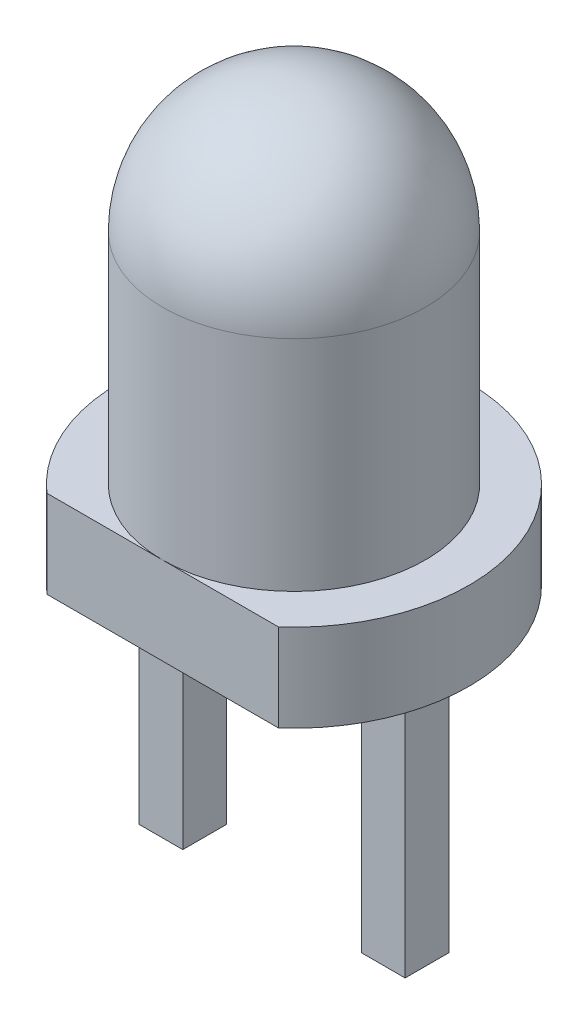
ISO-10303-21;
HEADER;
FILE_DESCRIPTION(('STEP AP214'),'2;1');
FILE_NAME('part.step','',(''),(''),'','','');
FILE_SCHEMA(('AUTOMOTIVE_DESIGN { 1 0 10303 214 1 1 1 1 }'));
ENDSEC;
DATA;
#1=APPLICATION_CONTEXT('core data for automotive mechanical design processes');
#2=APPLICATION_PROTOCOL_DEFINITION('international standard','automotive_design',2000,#1);
#3=PRODUCT_CONTEXT('',#1,'mechanical');
#4=PRODUCT('Part','Part','',(#3));
#5=PRODUCT_RELATED_PRODUCT_CATEGORY('part','',(#4));
#6=PRODUCT_DEFINITION_FORMATION('','',#4);
#7=PRODUCT_DEFINITION_CONTEXT('part definition',#1,'design');
#8=PRODUCT_DEFINITION('design','',#6,#7);
#9=PRODUCT_DEFINITION_SHAPE('','',#8);
#10=(LENGTH_UNIT() NAMED_UNIT(*) SI_UNIT(.MILLI.,.METRE.));
#11=(NAMED_UNIT(*) PLANE_ANGLE_UNIT() SI_UNIT($,.RADIAN.));
#12=(NAMED_UNIT(*) SI_UNIT($,.STERADIAN.) SOLID_ANGLE_UNIT());
#13=UNCERTAINTY_MEASURE_WITH_UNIT(LENGTH_MEASURE(1.E-05),#10,'distance_accuracy_value','');
#14=(GEOMETRIC_REPRESENTATION_CONTEXT(3) GLOBAL_UNCERTAINTY_ASSIGNED_CONTEXT((#13)) GLOBAL_UNIT_ASSIGNED_CONTEXT((#10,
#11,#12)) REPRESENTATION_CONTEXT('',''));
#15=CARTESIAN_POINT('',(0.,0.,0.));
#16=DIRECTION('',(0.,0.,1.));
#17=DIRECTION('',(1.,0.,0.));
#18=AXIS2_PLACEMENT_3D('',#15,#16,#17);
#19=CARTESIAN_POINT('',(1.02,-3.,0.25));
#20=DIRECTION('',(1.,0.,0.));
#21=DIRECTION('',(0.,0.,-1.));
#22=AXIS2_PLACEMENT_3D('',#19,#20,#21);
#23=PLANE('',#22);
#24=DIRECTION('',(0.,0.,-1.));
#25=VECTOR('',#24,1.);
#26=CARTESIAN_POINT('',(1.02,0.,0.25));
#27=LINE('',#26,#25);
#28=CARTESIAN_POINT('',(1.02,0.,0.25));
#29=VERTEX_POINT('',#28);
#30=CARTESIAN_POINT('',(1.02,0.,-0.25));
#31=VERTEX_POINT('',#30);
#32=EDGE_CURVE('E12',#29,#31,#27,.T.);
#33=ORIENTED_EDGE('',*,*,#32,.T.);
#34=DIRECTION('',(0.,1.,0.));
#35=VECTOR('',#34,1.);
#36=CARTESIAN_POINT('',(1.02,-3.,-0.25));
#37=LINE('',#36,#35);
#38=CARTESIAN_POINT('',(1.02,-3.,-0.25));
#39=VERTEX_POINT('',#38);
#40=EDGE_CURVE('E121',#39,#31,#37,.T.);
#41=ORIENTED_EDGE('',*,*,#40,.F.);
#42=DIRECTION('',(0.,0.,-1.));
#43=VECTOR('',#42,1.);
#44=CARTESIAN_POINT('',(1.02,-3.,0.25));
#45=LINE('',#44,#43);
#46=CARTESIAN_POINT('',(1.02,-3.,0.25));
#47=VERTEX_POINT('',#46);
#48=EDGE_CURVE('E54',#47,#39,#45,.T.);
#49=ORIENTED_EDGE('',*,*,#48,.F.);
#50=DIRECTION('',(0.,1.,0.));
#51=VECTOR('',#50,1.);
#52=CARTESIAN_POINT('',(1.02,-3.,0.25));
#53=LINE('',#52,#51);
#54=EDGE_CURVE('E109',#47,#29,#53,.T.);
#55=ORIENTED_EDGE('',*,*,#54,.T.);
#56=EDGE_LOOP('',(#33,#41,#49,#55));
#57=FACE_BOUND('',#56,.T.);
#58=ADVANCED_FACE('F50',(#57),#23,.F.);
#59=CARTESIAN_POINT('',(1.02,-3.,-0.25));
#60=DIRECTION('',(0.,0.,1.));
#61=DIRECTION('',(1.,0.,0.));
#62=AXIS2_PLACEMENT_3D('',#59,#60,#61);
#63=PLANE('',#62);
#64=DIRECTION('',(1.,0.,0.));
#65=VECTOR('',#64,1.);
#66=CARTESIAN_POINT('',(1.02,0.,-0.25));
#67=LINE('',#66,#65);
#68=CARTESIAN_POINT('',(1.52,0.,-0.25));
#69=VERTEX_POINT('',#68);
#70=EDGE_CURVE('E60',#31,#69,#67,.T.);
#71=ORIENTED_EDGE('',*,*,#70,.T.);
#72=DIRECTION('',(0.,1.,0.));
#73=VECTOR('',#72,1.);
#74=CARTESIAN_POINT('',(1.52,-3.,-0.25));
#75=LINE('',#74,#73);
#76=CARTESIAN_POINT('',(1.52,-3.,-0.25));
#77=VERTEX_POINT('',#76);
#78=EDGE_CURVE('E105',#77,#69,#75,.T.);
#79=ORIENTED_EDGE('',*,*,#78,.F.);
#80=DIRECTION('',(1.,0.,0.));
#81=VECTOR('',#80,1.);
#82=CARTESIAN_POINT('',(1.02,-3.,-0.25));
#83=LINE('',#82,#81);
#84=EDGE_CURVE('E84',#39,#77,#83,.T.);
#85=ORIENTED_EDGE('',*,*,#84,.F.);
#86=ORIENTED_EDGE('',*,*,#40,.T.);
#87=EDGE_LOOP('',(#71,#79,#85,#86));
#88=FACE_BOUND('',#87,.T.);
#89=ADVANCED_FACE('F124',(#88),#63,.F.);
#90=CARTESIAN_POINT('',(1.52,-3.,0.25));
#91=DIRECTION('',(-1.,0.,0.));
#92=DIRECTION('',(0.,0.,1.));
#93=AXIS2_PLACEMENT_3D('',#90,#91,#92);
#94=PLANE('',#93);
#95=DIRECTION('',(0.,0.,1.));
#96=VECTOR('',#95,1.);
#97=CARTESIAN_POINT('',(1.52,0.,0.25));
#98=LINE('',#97,#96);
#99=CARTESIAN_POINT('',(1.52,0.,0.25));
#100=VERTEX_POINT('',#99);
#101=EDGE_CURVE('E100',#69,#100,#98,.T.);
#102=ORIENTED_EDGE('',*,*,#101,.T.);
#103=DIRECTION('',(0.,1.,0.));
#104=VECTOR('',#103,1.);
#105=CARTESIAN_POINT('',(1.52,-3.,0.25));
#106=LINE('',#105,#104);
#107=CARTESIAN_POINT('',(1.52,-3.,0.25));
#108=VERTEX_POINT('',#107);
#109=EDGE_CURVE('E103',#108,#100,#106,.T.);
#110=ORIENTED_EDGE('',*,*,#109,.F.);
#111=DIRECTION('',(0.,0.,1.));
#112=VECTOR('',#111,1.);
#113=CARTESIAN_POINT('',(1.52,-3.,0.25));
#114=LINE('',#113,#112);
#115=EDGE_CURVE('E117',#77,#108,#114,.T.);
#116=ORIENTED_EDGE('',*,*,#115,.F.);
#117=ORIENTED_EDGE('',*,*,#78,.T.);
#118=EDGE_LOOP('',(#102,#110,#116,#117));
#119=FACE_BOUND('',#118,.T.);
#120=ADVANCED_FACE('F101',(#119),#94,.F.);
#121=CARTESIAN_POINT('',(1.02,-3.,0.25));
#122=DIRECTION('',(0.,0.,-1.));
#123=DIRECTION('',(-1.,0.,0.));
#124=AXIS2_PLACEMENT_3D('',#121,#122,#123);
#125=PLANE('',#124);
#126=DIRECTION('',(-1.,0.,0.));
#127=VECTOR('',#126,1.);
#128=CARTESIAN_POINT('',(1.02,0.,0.25));
#129=LINE('',#128,#127);
#130=EDGE_CURVE('E94',#100,#29,#129,.T.);
#131=ORIENTED_EDGE('',*,*,#130,.T.);
#132=ORIENTED_EDGE('',*,*,#54,.F.);
#133=DIRECTION('',(-1.,0.,0.));
#134=VECTOR('',#133,1.);
#135=CARTESIAN_POINT('',(1.02,-3.,0.25));
#136=LINE('',#135,#134);
#137=EDGE_CURVE('E108',#108,#47,#136,.T.);
#138=ORIENTED_EDGE('',*,*,#137,.F.);
#139=ORIENTED_EDGE('',*,*,#109,.T.);
#140=EDGE_LOOP('',(#131,#132,#138,#139));
#141=FACE_BOUND('',#140,.T.);
#142=ADVANCED_FACE('F107',(#141),#125,.F.);
#143=CARTESIAN_POINT('',(0.,-3.,0.));
#144=DIRECTION('',(0.,-1.,0.));
#145=DIRECTION('',(0.,0.,-1.));
#146=AXIS2_PLACEMENT_3D('',#143,#144,#145);
#147=PLANE('',#146);
#148=ORIENTED_EDGE('',*,*,#48,.T.);
#149=ORIENTED_EDGE('',*,*,#84,.T.);
#150=ORIENTED_EDGE('',*,*,#115,.T.);
#151=ORIENTED_EDGE('',*,*,#137,.T.);
#152=EDGE_LOOP('',(#148,#149,#150,#151));
#153=FACE_BOUND('',#152,.T.);
#154=ADVANCED_FACE('F52',(#153),#147,.T.);
#155=CARTESIAN_POINT('',(0.,0.,0.));
#156=DIRECTION('',(0.,-1.,0.));
#157=DIRECTION('',(0.,0.,-1.));
#158=AXIS2_PLACEMENT_3D('',#155,#156,#157);
#159=PLANE('',#158);
#160=ORIENTED_EDGE('',*,*,#32,.F.);
#161=ORIENTED_EDGE('',*,*,#130,.F.);
#162=ORIENTED_EDGE('',*,*,#101,.F.);
#163=ORIENTED_EDGE('',*,*,#70,.F.);
#164=EDGE_LOOP('',(#160,#161,#162,#163));
#165=FACE_BOUND('',#164,.T.);
#166=ADVANCED_FACE('F111',(#165),#159,.F.);
#167=CLOSED_SHELL('',(#58,#89,#120,#142,#154,#166));
#168=MANIFOLD_SOLID_BREP('B2',#167);
#169=CARTESIAN_POINT('',(-1.52,-3.,0.25));
#170=DIRECTION('',(1.,0.,0.));
#171=DIRECTION('',(0.,0.,-1.));
#172=AXIS2_PLACEMENT_3D('',#169,#170,#171);
#173=PLANE('',#172);
#174=DIRECTION('',(0.,0.,-1.));
#175=VECTOR('',#174,1.);
#176=CARTESIAN_POINT('',(-1.52,0.,0.25));
#177=LINE('',#176,#175);
#178=CARTESIAN_POINT('',(-1.52,0.,0.25));
#179=VERTEX_POINT('',#178);
#180=CARTESIAN_POINT('',(-1.52,0.,-0.25));
#181=VERTEX_POINT('',#180);
#182=EDGE_CURVE('E258',#179,#181,#177,.T.);
#183=ORIENTED_EDGE('',*,*,#182,.T.);
#184=DIRECTION('',(0.,1.,0.));
#185=VECTOR('',#184,1.);
#186=CARTESIAN_POINT('',(-1.52,-3.,-0.25));
#187=LINE('',#186,#185);
#188=CARTESIAN_POINT('',(-1.52,-3.,-0.25));
#189=VERTEX_POINT('',#188);
#190=EDGE_CURVE('E48',#189,#181,#187,.T.);
#191=ORIENTED_EDGE('',*,*,#190,.F.);
#192=DIRECTION('',(0.,0.,-1.));
#193=VECTOR('',#192,1.);
#194=CARTESIAN_POINT('',(-1.52,-3.,0.25));
#195=LINE('',#194,#193);
#196=CARTESIAN_POINT('',(-1.52,-3.,0.25));
#197=VERTEX_POINT('',#196);
#198=EDGE_CURVE('E246',#197,#189,#195,.T.);
#199=ORIENTED_EDGE('',*,*,#198,.F.);
#200=DIRECTION('',(0.,1.,0.));
#201=VECTOR('',#200,1.);
#202=CARTESIAN_POINT('',(-1.52,-3.,0.25));
#203=LINE('',#202,#201);
#204=EDGE_CURVE('E254',#197,#179,#203,.T.);
#205=ORIENTED_EDGE('',*,*,#204,.T.);
#206=EDGE_LOOP('',(#183,#191,#199,#205));
#207=FACE_BOUND('',#206,.T.);
#208=ADVANCED_FACE('F195',(#207),#173,.F.);
#209=CARTESIAN_POINT('',(-1.52,-3.,-0.25));
#210=DIRECTION('',(0.,0.,1.));
#211=DIRECTION('',(1.,0.,0.));
#212=AXIS2_PLACEMENT_3D('',#209,#210,#211);
#213=PLANE('',#212);
#214=DIRECTION('',(1.,0.,0.));
#215=VECTOR('',#214,1.);
#216=CARTESIAN_POINT('',(-1.52,0.,-0.25));
#217=LINE('',#216,#215);
#218=CARTESIAN_POINT('',(-1.02,0.,-0.25));
#219=VERTEX_POINT('',#218);
#220=EDGE_CURVE('E250',#181,#219,#217,.T.);
#221=ORIENTED_EDGE('',*,*,#220,.T.);
#222=DIRECTION('',(0.,1.,0.));
#223=VECTOR('',#222,1.);
#224=CARTESIAN_POINT('',(-1.02,-3.,-0.25));
#225=LINE('',#224,#223);
#226=CARTESIAN_POINT('',(-1.02,-3.,-0.25));
#227=VERTEX_POINT('',#226);
#228=EDGE_CURVE('E203',#227,#219,#225,.T.);
#229=ORIENTED_EDGE('',*,*,#228,.F.);
#230=DIRECTION('',(1.,0.,0.));
#231=VECTOR('',#230,1.);
#232=CARTESIAN_POINT('',(-1.52,-3.,-0.25));
#233=LINE('',#232,#231);
#234=EDGE_CURVE('E241',#189,#227,#233,.T.);
#235=ORIENTED_EDGE('',*,*,#234,.F.);
#236=ORIENTED_EDGE('',*,*,#190,.T.);
#237=EDGE_LOOP('',(#221,#229,#235,#236));
#238=FACE_BOUND('',#237,.T.);
#239=ADVANCED_FACE('F249',(#238),#213,.F.);
#240=CARTESIAN_POINT('',(-1.02,-3.,0.25));
#241=DIRECTION('',(-1.,0.,0.));
#242=DIRECTION('',(0.,0.,1.));
#243=AXIS2_PLACEMENT_3D('',#240,#241,#242);
#244=PLANE('',#243);
#245=DIRECTION('',(0.,0.,1.));
#246=VECTOR('',#245,1.);
#247=CARTESIAN_POINT('',(-1.02,0.,0.25));
#248=LINE('',#247,#246);
#249=CARTESIAN_POINT('',(-1.02,0.,0.25));
#250=VERTEX_POINT('',#249);
#251=EDGE_CURVE('E228',#219,#250,#248,.T.);
#252=ORIENTED_EDGE('',*,*,#251,.T.);
#253=DIRECTION('',(0.,1.,0.));
#254=VECTOR('',#253,1.);
#255=CARTESIAN_POINT('',(-1.02,-3.,0.25));
#256=LINE('',#255,#254);
#257=CARTESIAN_POINT('',(-1.02,-3.,0.25));
#258=VERTEX_POINT('',#257);
#259=EDGE_CURVE('E251',#258,#250,#256,.T.);
#260=ORIENTED_EDGE('',*,*,#259,.F.);
#261=DIRECTION('',(0.,0.,1.));
#262=VECTOR('',#261,1.);
#263=CARTESIAN_POINT('',(-1.02,-3.,0.25));
#264=LINE('',#263,#262);
#265=EDGE_CURVE('E244',#227,#258,#264,.T.);
#266=ORIENTED_EDGE('',*,*,#265,.F.);
#267=ORIENTED_EDGE('',*,*,#228,.T.);
#268=EDGE_LOOP('',(#252,#260,#266,#267));
#269=FACE_BOUND('',#268,.T.);
#270=ADVANCED_FACE('F252',(#269),#244,.F.);
#271=CARTESIAN_POINT('',(-1.52,-3.,0.25));
#272=DIRECTION('',(0.,0.,-1.));
#273=DIRECTION('',(-1.,0.,0.));
#274=AXIS2_PLACEMENT_3D('',#271,#272,#273);
#275=PLANE('',#274);
#276=DIRECTION('',(-1.,0.,0.));
#277=VECTOR('',#276,1.);
#278=CARTESIAN_POINT('',(-1.52,0.,0.25));
#279=LINE('',#278,#277);
#280=EDGE_CURVE('E234',#250,#179,#279,.T.);
#281=ORIENTED_EDGE('',*,*,#280,.T.);
#282=ORIENTED_EDGE('',*,*,#204,.F.);
#283=DIRECTION('',(-1.,0.,0.));
#284=VECTOR('',#283,1.);
#285=CARTESIAN_POINT('',(-1.52,-3.,0.25));
#286=LINE('',#285,#284);
#287=EDGE_CURVE('E211',#258,#197,#286,.T.);
#288=ORIENTED_EDGE('',*,*,#287,.F.);
#289=ORIENTED_EDGE('',*,*,#259,.T.);
#290=EDGE_LOOP('',(#281,#282,#288,#289));
#291=FACE_BOUND('',#290,.T.);
#292=ADVANCED_FACE('F265',(#291),#275,.F.);
#293=CARTESIAN_POINT('',(0.,-3.,0.));
#294=DIRECTION('',(0.,-1.,0.));
#295=DIRECTION('',(0.,0.,-1.));
#296=AXIS2_PLACEMENT_3D('',#293,#294,#295);
#297=PLANE('',#296);
#298=ORIENTED_EDGE('',*,*,#198,.T.);
#299=ORIENTED_EDGE('',*,*,#234,.T.);
#300=ORIENTED_EDGE('',*,*,#265,.T.);
#301=ORIENTED_EDGE('',*,*,#287,.T.);
#302=EDGE_LOOP('',(#298,#299,#300,#301));
#303=FACE_BOUND('',#302,.T.);
#304=ADVANCED_FACE('F242',(#303),#297,.T.);
#305=CARTESIAN_POINT('',(0.,0.,0.));
#306=DIRECTION('',(0.,-1.,0.));
#307=DIRECTION('',(0.,0.,-1.));
#308=AXIS2_PLACEMENT_3D('',#305,#306,#307);
#309=PLANE('',#308);
#310=ORIENTED_EDGE('',*,*,#182,.F.);
#311=ORIENTED_EDGE('',*,*,#280,.F.);
#312=ORIENTED_EDGE('',*,*,#251,.F.);
#313=ORIENTED_EDGE('',*,*,#220,.F.);
#314=EDGE_LOOP('',(#310,#311,#312,#313));
#315=FACE_BOUND('',#314,.T.);
#316=ADVANCED_FACE('F268',(#315),#309,.F.);
#317=CLOSED_SHELL('',(#208,#239,#270,#292,#304,#316));
#318=MANIFOLD_SOLID_BREP('B6',#317);
#319=CARTESIAN_POINT('',(0.,5.,0.));
#320=DIRECTION('',(0.,1.,0.));
#321=DIRECTION('',(0.,0.,1.));
#322=AXIS2_PLACEMENT_3D('',#319,#320,#321);
#323=CYLINDRICAL_SURFACE('',#322,1.5);
#324=CARTESIAN_POINT('',(0.,1.,0.));
#325=DIRECTION('',(0.,1.,0.));
#326=DIRECTION('',(0.,0.,1.));
#327=AXIS2_PLACEMENT_3D('',#324,#325,#326);
#328=CIRCLE('',#327,1.5);
#329=CARTESIAN_POINT('',(0.,1.,1.5));
#330=VERTEX_POINT('',#329);
#331=EDGE_CURVE('E193',#330,#330,#328,.F.);
#332=ORIENTED_EDGE('',*,*,#331,.F.);
#333=EDGE_LOOP('',(#332));
#334=FACE_BOUND('',#333,.T.);
#335=CARTESIAN_POINT('',(0.,3.5,0.));
#336=DIRECTION('',(0.,1.,0.));
#337=DIRECTION('',(0.,0.,1.));
#338=AXIS2_PLACEMENT_3D('',#335,#336,#337);
#339=CIRCLE('',#338,1.5);
#340=CARTESIAN_POINT('',(0.,3.5,1.5));
#341=VERTEX_POINT('',#340);
#342=EDGE_CURVE('E339',#341,#341,#339,.T.);
#343=ORIENTED_EDGE('',*,*,#342,.F.);
#344=EDGE_LOOP('',(#343));
#345=FACE_BOUND('',#344,.T.);
#346=ADVANCED_FACE('F331',(#334,#345),#323,.T.);
#347=CARTESIAN_POINT('',(0.,3.5,0.));
#348=DIRECTION('',(0.,1.,0.));
#349=DIRECTION('',(0.,0.,1.));
#350=AXIS2_PLACEMENT_3D('',#347,#348,#349);
#351=SPHERICAL_SURFACE('',#350,1.5);
#352=ORIENTED_EDGE('',*,*,#342,.T.);
#353=EDGE_LOOP('',(#352));
#354=FACE_BOUND('',#353,.T.);
#355=ADVANCED_FACE('F384',(#354),#351,.T.);
#356=CARTESIAN_POINT('',(-1.3228756555323,1.,1.5));
#357=DIRECTION('',(0.,0.,-1.));
#358=DIRECTION('',(-1.,0.,0.));
#359=AXIS2_PLACEMENT_3D('',#356,#357,#358);
#360=PLANE('',#359);
#361=DIRECTION('',(1.,0.,0.));
#362=VECTOR('',#361,1.);
#363=CARTESIAN_POINT('',(-1.3228756555323,1.,1.5));
#364=LINE('',#363,#362);
#365=CARTESIAN_POINT('',(1.3228756555323,1.,1.5));
#366=VERTEX_POINT('',#365);
#367=EDGE_CURVE('E349',#330,#366,#364,.T.);
#368=ORIENTED_EDGE('',*,*,#367,.F.);
#369=CARTESIAN_POINT('',(-1.3228756555323,1.,1.5));
#370=VERTEX_POINT('',#369);
#371=EDGE_CURVE('E375',#370,#330,#364,.T.);
#372=ORIENTED_EDGE('',*,*,#371,.F.);
#373=DIRECTION('',(0.,-1.,0.));
#374=VECTOR('',#373,1.);
#375=CARTESIAN_POINT('',(-1.3228756555323,1.,1.5));
#376=LINE('',#375,#374);
#377=CARTESIAN_POINT('',(-1.3228756555323,0.,1.5));
#378=VERTEX_POINT('',#377);
#379=EDGE_CURVE('E366',#370,#378,#376,.T.);
#380=ORIENTED_EDGE('',*,*,#379,.T.);
#381=DIRECTION('',(1.,0.,0.));
#382=VECTOR('',#381,1.);
#383=CARTESIAN_POINT('',(-1.3228756555323,0.,1.5));
#384=LINE('',#383,#382);
#385=CARTESIAN_POINT('',(1.3228756555323,0.,1.5));
#386=VERTEX_POINT('',#385);
#387=EDGE_CURVE('E360',#378,#386,#384,.T.);
#388=ORIENTED_EDGE('',*,*,#387,.T.);
#389=DIRECTION('',(0.,-1.,0.));
#390=VECTOR('',#389,1.);
#391=CARTESIAN_POINT('',(1.3228756555323,1.,1.5));
#392=LINE('',#391,#390);
#393=EDGE_CURVE('E363',#366,#386,#392,.T.);
#394=ORIENTED_EDGE('',*,*,#393,.F.);
#395=EDGE_LOOP('',(#368,#372,#380,#388,#394));
#396=FACE_BOUND('',#395,.T.);
#397=ADVANCED_FACE('F362',(#396),#360,.F.);
#398=CARTESIAN_POINT('',(0.,1.,0.));
#399=DIRECTION('',(0.,-1.,0.));
#400=DIRECTION('',(0.,0.,-1.));
#401=AXIS2_PLACEMENT_3D('',#398,#399,#400);
#402=CYLINDRICAL_SURFACE('',#401,2.);
#403=CARTESIAN_POINT('',(0.,0.,0.));
#404=DIRECTION('',(0.,1.,0.));
#405=DIRECTION('',(0.,0.,1.));
#406=AXIS2_PLACEMENT_3D('',#403,#404,#405);
#407=CIRCLE('',#406,2.);
#408=EDGE_CURVE('E371',#386,#378,#407,.T.);
#409=ORIENTED_EDGE('',*,*,#408,.T.);
#410=ORIENTED_EDGE('',*,*,#379,.F.);
#411=CARTESIAN_POINT('',(0.,1.,0.));
#412=DIRECTION('',(0.,1.,0.));
#413=DIRECTION('',(0.,0.,1.));
#414=AXIS2_PLACEMENT_3D('',#411,#412,#413);
#415=CIRCLE('',#414,2.);
#416=EDGE_CURVE('E370',#366,#370,#415,.T.);
#417=ORIENTED_EDGE('',*,*,#416,.F.);
#418=ORIENTED_EDGE('',*,*,#393,.T.);
#419=EDGE_LOOP('',(#409,#410,#417,#418));
#420=FACE_BOUND('',#419,.T.);
#421=ADVANCED_FACE('F374',(#420),#402,.T.);
#422=CARTESIAN_POINT('',(0.,1.,0.));
#423=DIRECTION('',(0.,1.,0.));
#424=DIRECTION('',(0.,0.,1.));
#425=AXIS2_PLACEMENT_3D('',#422,#423,#424);
#426=PLANE('',#425);
#427=ORIENTED_EDGE('',*,*,#371,.T.);
#428=ORIENTED_EDGE('',*,*,#331,.T.);
#429=ORIENTED_EDGE('',*,*,#367,.T.);
#430=ORIENTED_EDGE('',*,*,#416,.T.);
#431=EDGE_LOOP('',(#427,#428,#429,#430));
#432=FACE_BOUND('',#431,.T.);
#433=ADVANCED_FACE('F394',(#432),#426,.T.);
#434=CARTESIAN_POINT('',(0.,0.,0.));
#435=DIRECTION('',(0.,-1.,0.));
#436=DIRECTION('',(0.,0.,-1.));
#437=AXIS2_PLACEMENT_3D('',#434,#435,#436);
#438=PLANE('',#437);
#439=ORIENTED_EDGE('',*,*,#387,.F.);
#440=ORIENTED_EDGE('',*,*,#408,.F.);
#441=EDGE_LOOP('',(#439,#440));
#442=FACE_BOUND('',#441,.T.);
#443=ADVANCED_FACE('F333',(#442),#438,.T.);
#444=CLOSED_SHELL('',(#346,#355,#397,#421,#433,#443));
#445=MANIFOLD_SOLID_BREP('B42',#444);
#446=ADVANCED_BREP_SHAPE_REPRESENTATION('',(#18,#168,#318,#445),#14);
#447=SHAPE_DEFINITION_REPRESENTATION(#9,#446);
ENDSEC;
END-ISO-10303-21;
